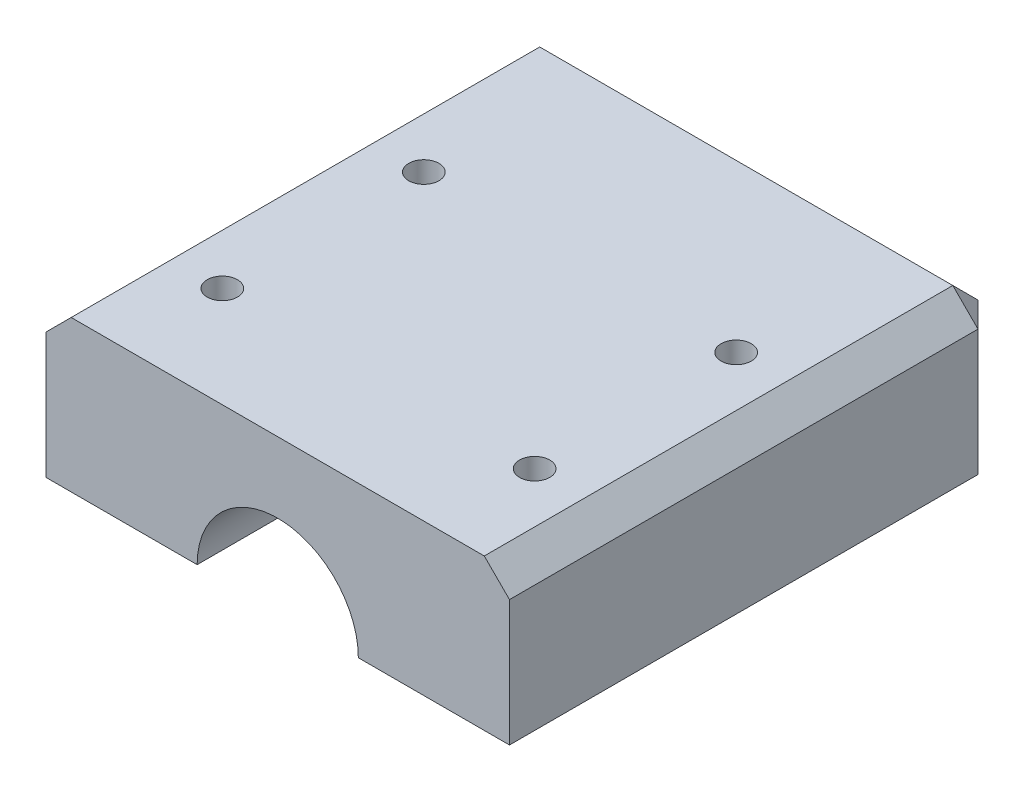
ISO-10303-21;
HEADER;
FILE_DESCRIPTION(('STEP AP214'),'2;1');
FILE_NAME('part.step','',(''),(''),'','','');
FILE_SCHEMA(('AUTOMOTIVE_DESIGN { 1 0 10303 214 1 1 1 1 }'));
ENDSEC;
DATA;
#1=APPLICATION_CONTEXT('core data for automotive mechanical design processes');
#2=APPLICATION_PROTOCOL_DEFINITION('international standard','automotive_design',2000,#1);
#3=PRODUCT_CONTEXT('',#1,'mechanical');
#4=PRODUCT('Part','Part','',(#3));
#5=PRODUCT_RELATED_PRODUCT_CATEGORY('part','',(#4));
#6=PRODUCT_DEFINITION_FORMATION('','',#4);
#7=PRODUCT_DEFINITION_CONTEXT('part definition',#1,'design');
#8=PRODUCT_DEFINITION('design','',#6,#7);
#9=PRODUCT_DEFINITION_SHAPE('','',#8);
#10=(LENGTH_UNIT() NAMED_UNIT(*) SI_UNIT(.MILLI.,.METRE.));
#11=(NAMED_UNIT(*) PLANE_ANGLE_UNIT() SI_UNIT($,.RADIAN.));
#12=(NAMED_UNIT(*) SI_UNIT($,.STERADIAN.) SOLID_ANGLE_UNIT());
#13=UNCERTAINTY_MEASURE_WITH_UNIT(LENGTH_MEASURE(1.E-05),#10,'distance_accuracy_value','');
#14=(GEOMETRIC_REPRESENTATION_CONTEXT(3) GLOBAL_UNCERTAINTY_ASSIGNED_CONTEXT((#13)) GLOBAL_UNIT_ASSIGNED_CONTEXT((#10,
#11,#12)) REPRESENTATION_CONTEXT('',''));
#15=CARTESIAN_POINT('',(0.,0.,0.));
#16=DIRECTION('',(0.,0.,1.));
#17=DIRECTION('',(1.,0.,0.));
#18=AXIS2_PLACEMENT_3D('',#15,#16,#17);
#19=CARTESIAN_POINT('',(0.,0.,-45.));
#20=DIRECTION('',(0.,0.,1.));
#21=DIRECTION('',(1.,0.,0.));
#22=AXIS2_PLACEMENT_3D('',#19,#20,#21);
#23=PLANE('',#22);
#24=DIRECTION('',(0.,-1.,0.));
#25=VECTOR('',#24,1.);
#26=CARTESIAN_POINT('',(-18.,0.,-45.));
#27=LINE('',#26,#25);
#28=CARTESIAN_POINT('',(-18.,4.,-45.));
#29=VERTEX_POINT('',#28);
#30=CARTESIAN_POINT('',(-18.,0.,-45.));
#31=VERTEX_POINT('',#30);
#32=EDGE_CURVE('E152',#29,#31,#27,.T.);
#33=ORIENTED_EDGE('',*,*,#32,.F.);
#34=DIRECTION('',(-1.,0.,0.));
#35=VECTOR('',#34,1.);
#36=CARTESIAN_POINT('',(18.,4.,-45.));
#37=LINE('',#36,#35);
#38=CARTESIAN_POINT('',(18.,4.,-45.));
#39=VERTEX_POINT('',#38);
#40=EDGE_CURVE('E181',#39,#29,#37,.T.);
#41=ORIENTED_EDGE('',*,*,#40,.F.);
#42=DIRECTION('',(0.,1.,0.));
#43=VECTOR('',#42,1.);
#44=CARTESIAN_POINT('',(18.,0.,-45.));
#45=LINE('',#44,#43);
#46=CARTESIAN_POINT('',(18.,0.,-45.));
#47=VERTEX_POINT('',#46);
#48=EDGE_CURVE('E179',#47,#39,#45,.T.);
#49=ORIENTED_EDGE('',*,*,#48,.F.);
#50=DIRECTION('',(1.,0.,0.));
#51=VECTOR('',#50,1.);
#52=CARTESIAN_POINT('',(8.,0.,-45.));
#53=LINE('',#52,#51);
#54=EDGE_CURVE('E160',#31,#47,#53,.T.);
#55=ORIENTED_EDGE('',*,*,#54,.F.);
#56=EDGE_LOOP('',(#33,#41,#49,#55));
#57=FACE_BOUND('',#56,.T.);
#58=ADVANCED_FACE('F42',(#57),#23,.F.);
#59=CARTESIAN_POINT('',(0.,0.,-45.));
#60=DIRECTION('',(0.,0.,1.));
#61=DIRECTION('',(1.,0.,0.));
#62=AXIS2_PLACEMENT_3D('',#59,#60,#61);
#63=CYLINDRICAL_SURFACE('',#62,8.);
#64=CARTESIAN_POINT('',(0.,0.,-40.));
#65=DIRECTION('',(0.,0.,1.));
#66=DIRECTION('',(1.,0.,0.));
#67=AXIS2_PLACEMENT_3D('',#64,#65,#66);
#68=CIRCLE('',#67,8.);
#69=CARTESIAN_POINT('',(8.,0.,-40.));
#70=VERTEX_POINT('',#69);
#71=CARTESIAN_POINT('',(-8.,0.,-40.));
#72=VERTEX_POINT('',#71);
#73=EDGE_CURVE('E193',#70,#72,#68,.T.);
#74=ORIENTED_EDGE('',*,*,#73,.F.);
#75=DIRECTION('',(0.,0.,1.));
#76=VECTOR('',#75,1.);
#77=CARTESIAN_POINT('',(8.,0.,-45.));
#78=LINE('',#77,#76);
#79=CARTESIAN_POINT('',(8.,0.,0.));
#80=VERTEX_POINT('',#79);
#81=EDGE_CURVE('E198',#70,#80,#78,.T.);
#82=ORIENTED_EDGE('',*,*,#81,.T.);
#83=CARTESIAN_POINT('',(0.,0.,0.));
#84=DIRECTION('',(0.,0.,-1.));
#85=DIRECTION('',(1.,0.,0.));
#86=AXIS2_PLACEMENT_3D('',#83,#84,#85);
#87=CIRCLE('',#86,8.);
#88=CARTESIAN_POINT('',(-8.,0.,0.));
#89=VERTEX_POINT('',#88);
#90=EDGE_CURVE('E196',#89,#80,#87,.T.);
#91=ORIENTED_EDGE('',*,*,#90,.F.);
#92=DIRECTION('',(0.,0.,1.));
#93=VECTOR('',#92,1.);
#94=CARTESIAN_POINT('',(-8.,0.,-45.));
#95=LINE('',#94,#93);
#96=EDGE_CURVE('E216',#72,#89,#95,.T.);
#97=ORIENTED_EDGE('',*,*,#96,.F.);
#98=EDGE_LOOP('',(#74,#82,#91,#97));
#99=FACE_BOUND('',#98,.T.);
#100=ADVANCED_FACE('F336',(#99),#63,.F.);
#101=CARTESIAN_POINT('',(-8.,0.,-45.));
#102=DIRECTION('',(0.,-1.,0.));
#103=DIRECTION('',(1.,0.,0.));
#104=AXIS2_PLACEMENT_3D('',#101,#102,#103);
#105=PLANE('',#104);
#106=CARTESIAN_POINT('',(-15.5,0.,-10.));
#107=DIRECTION('',(0.,-1.,0.));
#108=DIRECTION('',(-1.,0.,0.));
#109=AXIS2_PLACEMENT_3D('',#106,#107,#108);
#110=CIRCLE('',#109,1.5);
#111=CARTESIAN_POINT('',(-17.,0.,-10.));
#112=VERTEX_POINT('',#111);
#113=EDGE_CURVE('E551',#112,#112,#110,.T.);
#114=ORIENTED_EDGE('',*,*,#113,.F.);
#115=EDGE_LOOP('',(#114));
#116=FACE_BOUND('',#115,.T.);
#117=CARTESIAN_POINT('',(-15.5,0.,-30.));
#118=DIRECTION('',(0.,-1.,0.));
#119=DIRECTION('',(-1.,0.,0.));
#120=AXIS2_PLACEMENT_3D('',#117,#118,#119);
#121=CIRCLE('',#120,1.5);
#122=CARTESIAN_POINT('',(-17.,0.,-30.));
#123=VERTEX_POINT('',#122);
#124=EDGE_CURVE('E548',#123,#123,#121,.T.);
#125=ORIENTED_EDGE('',*,*,#124,.F.);
#126=EDGE_LOOP('',(#125));
#127=FACE_BOUND('',#126,.T.);
#128=CARTESIAN_POINT('',(15.5,0.,-30.));
#129=DIRECTION('',(0.,-1.,0.));
#130=DIRECTION('',(1.,0.,0.));
#131=AXIS2_PLACEMENT_3D('',#128,#129,#130);
#132=CIRCLE('',#131,1.5);
#133=CARTESIAN_POINT('',(17.,0.,-30.));
#134=VERTEX_POINT('',#133);
#135=EDGE_CURVE('E550',#134,#134,#132,.T.);
#136=ORIENTED_EDGE('',*,*,#135,.F.);
#137=EDGE_LOOP('',(#136));
#138=FACE_BOUND('',#137,.T.);
#139=CARTESIAN_POINT('',(15.5,0.,-10.));
#140=DIRECTION('',(0.,-1.,0.));
#141=DIRECTION('',(1.,0.,0.));
#142=AXIS2_PLACEMENT_3D('',#139,#140,#141);
#143=CIRCLE('',#142,1.5);
#144=CARTESIAN_POINT('',(17.,0.,-10.));
#145=VERTEX_POINT('',#144);
#146=EDGE_CURVE('E268',#145,#145,#143,.T.);
#147=ORIENTED_EDGE('',*,*,#146,.F.);
#148=EDGE_LOOP('',(#147));
#149=FACE_BOUND('',#148,.T.);
#150=DIRECTION('',(0.,0.,1.));
#151=VECTOR('',#150,1.);
#152=CARTESIAN_POINT('',(-23.,0.,-45.));
#153=LINE('',#152,#151);
#154=CARTESIAN_POINT('',(-23.,0.,-46.5));
#155=VERTEX_POINT('',#154);
#156=CARTESIAN_POINT('',(-23.,0.,0.));
#157=VERTEX_POINT('',#156);
#158=EDGE_CURVE('E219',#155,#157,#153,.T.);
#159=ORIENTED_EDGE('',*,*,#158,.F.);
#160=DIRECTION('',(-0.707106781186546,0.,0.70710678118655));
#161=VECTOR('',#160,1.);
#162=CARTESIAN_POINT('',(-16.25,0.,-53.25));
#163=LINE('',#162,#161);
#164=CARTESIAN_POINT('',(-20.5,0.,-49.));
#165=VERTEX_POINT('',#164);
#166=EDGE_CURVE('E244',#155,#165,#163,.F.);
#167=ORIENTED_EDGE('',*,*,#166,.T.);
#168=DIRECTION('',(-1.,0.,0.));
#169=VECTOR('',#168,1.);
#170=CARTESIAN_POINT('',(-23.,0.,-49.));
#171=LINE('',#170,#169);
#172=CARTESIAN_POINT('',(-18.,0.,-49.));
#173=VERTEX_POINT('',#172);
#174=EDGE_CURVE('E176',#173,#165,#171,.T.);
#175=ORIENTED_EDGE('',*,*,#174,.F.);
#176=DIRECTION('',(0.,0.,1.));
#177=VECTOR('',#176,1.);
#178=CARTESIAN_POINT('',(-18.,0.,-49.));
#179=LINE('',#178,#177);
#180=EDGE_CURVE('E178',#173,#31,#179,.T.);
#181=ORIENTED_EDGE('',*,*,#180,.T.);
#182=ORIENTED_EDGE('',*,*,#54,.T.);
#183=DIRECTION('',(0.,0.,1.));
#184=VECTOR('',#183,1.);
#185=CARTESIAN_POINT('',(18.,0.,-49.));
#186=LINE('',#185,#184);
#187=CARTESIAN_POINT('',(18.,0.,-49.));
#188=VERTEX_POINT('',#187);
#189=EDGE_CURVE('E156',#188,#47,#186,.T.);
#190=ORIENTED_EDGE('',*,*,#189,.F.);
#191=DIRECTION('',(-1.,0.,0.));
#192=VECTOR('',#191,1.);
#193=CARTESIAN_POINT('',(23.,0.,-49.));
#194=LINE('',#193,#192);
#195=CARTESIAN_POINT('',(20.5,0.,-49.));
#196=VERTEX_POINT('',#195);
#197=EDGE_CURVE('E143',#196,#188,#194,.T.);
#198=ORIENTED_EDGE('',*,*,#197,.F.);
#199=DIRECTION('',(-0.70710678118655,0.,-0.707106781186546));
#200=VECTOR('',#199,1.);
#201=CARTESIAN_POINT('',(8.24999999999992,0.,-61.25));
#202=LINE('',#201,#200);
#203=CARTESIAN_POINT('',(23.,0.,-46.5));
#204=VERTEX_POINT('',#203);
#205=EDGE_CURVE('E66',#196,#204,#202,.F.);
#206=ORIENTED_EDGE('',*,*,#205,.T.);
#207=DIRECTION('',(0.,0.,1.));
#208=VECTOR('',#207,1.);
#209=CARTESIAN_POINT('',(23.,0.,-45.));
#210=LINE('',#209,#208);
#211=CARTESIAN_POINT('',(23.,0.,0.));
#212=VERTEX_POINT('',#211);
#213=EDGE_CURVE('E221',#204,#212,#210,.T.);
#214=ORIENTED_EDGE('',*,*,#213,.T.);
#215=DIRECTION('',(1.,0.,0.));
#216=VECTOR('',#215,1.);
#217=CARTESIAN_POINT('',(8.,0.,0.));
#218=LINE('',#217,#216);
#219=EDGE_CURVE('E202',#80,#212,#218,.T.);
#220=ORIENTED_EDGE('',*,*,#219,.F.);
#221=ORIENTED_EDGE('',*,*,#81,.F.);
#222=DIRECTION('',(-1.,0.,0.));
#223=VECTOR('',#222,1.);
#224=CARTESIAN_POINT('',(23.,0.,-40.));
#225=LINE('',#224,#223);
#226=EDGE_CURVE('E163',#70,#72,#225,.T.);
#227=ORIENTED_EDGE('',*,*,#226,.T.);
#228=ORIENTED_EDGE('',*,*,#96,.T.);
#229=DIRECTION('',(1.,0.,0.));
#230=VECTOR('',#229,1.);
#231=CARTESIAN_POINT('',(-8.,0.,0.));
#232=LINE('',#231,#230);
#233=EDGE_CURVE('E199',#157,#89,#232,.T.);
#234=ORIENTED_EDGE('',*,*,#233,.F.);
#235=EDGE_LOOP('',(#159,#167,#175,#181,#182,#190,#198,#206,#214,#220,#221,#227,#228,#234));
#236=FACE_BOUND('',#235,.T.);
#237=ADVANCED_FACE('F158',(#116,#127,#138,#149,#236),#105,.T.);
#238=CARTESIAN_POINT('',(-23.,0.,-45.));
#239=DIRECTION('',(-1.,0.,0.));
#240=DIRECTION('',(0.,0.,1.));
#241=AXIS2_PLACEMENT_3D('',#238,#239,#240);
#242=PLANE('',#241);
#243=DIRECTION('',(0.,-1.,0.));
#244=VECTOR('',#243,1.);
#245=CARTESIAN_POINT('',(-23.,0.,0.));
#246=LINE('',#245,#244);
#247=CARTESIAN_POINT('',(-23.,12.5,0.));
#248=VERTEX_POINT('',#247);
#249=EDGE_CURVE('E211',#248,#157,#246,.T.);
#250=ORIENTED_EDGE('',*,*,#249,.F.);
#251=DIRECTION('',(0.,0.,-1.));
#252=VECTOR('',#251,1.);
#253=CARTESIAN_POINT('',(-23.,12.5,-45.));
#254=LINE('',#253,#252);
#255=CARTESIAN_POINT('',(-23.,12.5,-46.5));
#256=VERTEX_POINT('',#255);
#257=EDGE_CURVE('E236',#248,#256,#254,.T.);
#258=ORIENTED_EDGE('',*,*,#257,.T.);
#259=DIRECTION('',(0.,-1.,0.));
#260=VECTOR('',#259,1.);
#261=CARTESIAN_POINT('',(-23.,0.,-46.5));
#262=LINE('',#261,#260);
#263=EDGE_CURVE('E234',#256,#155,#262,.T.);
#264=ORIENTED_EDGE('',*,*,#263,.T.);
#265=ORIENTED_EDGE('',*,*,#158,.T.);
#266=EDGE_LOOP('',(#250,#258,#264,#265));
#267=FACE_BOUND('',#266,.T.);
#268=ADVANCED_FACE('F284',(#267),#242,.T.);
#269=CARTESIAN_POINT('',(-23.,15.,-45.));
#270=DIRECTION('',(0.,1.,0.));
#271=DIRECTION('',(-1.,0.,0.));
#272=AXIS2_PLACEMENT_3D('',#269,#270,#271);
#273=PLANE('',#272);
#274=CARTESIAN_POINT('',(-15.5,15.,-10.));
#275=DIRECTION('',(0.,1.,0.));
#276=DIRECTION('',(-1.,0.,0.));
#277=AXIS2_PLACEMENT_3D('',#274,#275,#276);
#278=CIRCLE('',#277,1.5);
#279=CARTESIAN_POINT('',(-17.,15.,-10.));
#280=VERTEX_POINT('',#279);
#281=EDGE_CURVE('E47',#280,#280,#278,.T.);
#282=ORIENTED_EDGE('',*,*,#281,.F.);
#283=EDGE_LOOP('',(#282));
#284=FACE_BOUND('',#283,.T.);
#285=CARTESIAN_POINT('',(-15.5,15.,-30.));
#286=DIRECTION('',(0.,1.,0.));
#287=DIRECTION('',(-1.,0.,0.));
#288=AXIS2_PLACEMENT_3D('',#285,#286,#287);
#289=CIRCLE('',#288,1.5);
#290=CARTESIAN_POINT('',(-17.,15.,-30.));
#291=VERTEX_POINT('',#290);
#292=EDGE_CURVE('E270',#291,#291,#289,.T.);
#293=ORIENTED_EDGE('',*,*,#292,.F.);
#294=EDGE_LOOP('',(#293));
#295=FACE_BOUND('',#294,.T.);
#296=CARTESIAN_POINT('',(15.5,15.,-30.));
#297=DIRECTION('',(0.,1.,0.));
#298=DIRECTION('',(-1.,0.,0.));
#299=AXIS2_PLACEMENT_3D('',#296,#297,#298);
#300=CIRCLE('',#299,1.5);
#301=CARTESIAN_POINT('',(14.,15.,-30.));
#302=VERTEX_POINT('',#301);
#303=EDGE_CURVE('E267',#302,#302,#300,.T.);
#304=ORIENTED_EDGE('',*,*,#303,.F.);
#305=EDGE_LOOP('',(#304));
#306=FACE_BOUND('',#305,.T.);
#307=CARTESIAN_POINT('',(15.5,15.,-10.));
#308=DIRECTION('',(0.,1.,0.));
#309=DIRECTION('',(-1.,0.,0.));
#310=AXIS2_PLACEMENT_3D('',#307,#308,#309);
#311=CIRCLE('',#310,1.5);
#312=CARTESIAN_POINT('',(14.,15.,-10.));
#313=VERTEX_POINT('',#312);
#314=EDGE_CURVE('E264',#313,#313,#311,.T.);
#315=ORIENTED_EDGE('',*,*,#314,.F.);
#316=EDGE_LOOP('',(#315));
#317=FACE_BOUND('',#316,.T.);
#318=DIRECTION('',(-1.,0.,0.));
#319=VECTOR('',#318,1.);
#320=CARTESIAN_POINT('',(-23.,15.,-46.5));
#321=LINE('',#320,#319);
#322=CARTESIAN_POINT('',(20.5,15.,-46.5));
#323=VERTEX_POINT('',#322);
#324=CARTESIAN_POINT('',(-20.5,15.,-46.5));
#325=VERTEX_POINT('',#324);
#326=EDGE_CURVE('E225',#323,#325,#321,.T.);
#327=ORIENTED_EDGE('',*,*,#326,.T.);
#328=DIRECTION('',(0.,0.,1.));
#329=VECTOR('',#328,1.);
#330=CARTESIAN_POINT('',(-20.5,15.,-45.));
#331=LINE('',#330,#329);
#332=CARTESIAN_POINT('',(-20.5,15.,0.));
#333=VERTEX_POINT('',#332);
#334=EDGE_CURVE('E227',#325,#333,#331,.T.);
#335=ORIENTED_EDGE('',*,*,#334,.T.);
#336=DIRECTION('',(-1.,0.,0.));
#337=VECTOR('',#336,1.);
#338=CARTESIAN_POINT('',(-23.,15.,0.));
#339=LINE('',#338,#337);
#340=CARTESIAN_POINT('',(20.5,15.,0.));
#341=VERTEX_POINT('',#340);
#342=EDGE_CURVE('E208',#341,#333,#339,.T.);
#343=ORIENTED_EDGE('',*,*,#342,.F.);
#344=DIRECTION('',(0.,0.,-1.));
#345=VECTOR('',#344,1.);
#346=CARTESIAN_POINT('',(20.5,15.,-45.));
#347=LINE('',#346,#345);
#348=EDGE_CURVE('E218',#341,#323,#347,.T.);
#349=ORIENTED_EDGE('',*,*,#348,.T.);
#350=EDGE_LOOP('',(#327,#335,#343,#349));
#351=FACE_BOUND('',#350,.T.);
#352=ADVANCED_FACE('F280',(#284,#295,#306,#317,#351),#273,.T.);
#353=CARTESIAN_POINT('',(23.,0.,-45.));
#354=DIRECTION('',(1.,0.,0.));
#355=DIRECTION('',(0.,1.,0.));
#356=AXIS2_PLACEMENT_3D('',#353,#354,#355);
#357=PLANE('',#356);
#358=ORIENTED_EDGE('',*,*,#213,.F.);
#359=DIRECTION('',(0.,1.,0.));
#360=VECTOR('',#359,1.);
#361=CARTESIAN_POINT('',(23.,0.,-46.5));
#362=LINE('',#361,#360);
#363=CARTESIAN_POINT('',(23.,12.5,-46.5));
#364=VERTEX_POINT('',#363);
#365=EDGE_CURVE('E11',#204,#364,#362,.T.);
#366=ORIENTED_EDGE('',*,*,#365,.T.);
#367=DIRECTION('',(0.,0.,1.));
#368=VECTOR('',#367,1.);
#369=CARTESIAN_POINT('',(23.,12.5,-45.));
#370=LINE('',#369,#368);
#371=CARTESIAN_POINT('',(23.,12.5,0.));
#372=VERTEX_POINT('',#371);
#373=EDGE_CURVE('E52',#364,#372,#370,.T.);
#374=ORIENTED_EDGE('',*,*,#373,.T.);
#375=DIRECTION('',(0.,1.,0.));
#376=VECTOR('',#375,1.);
#377=CARTESIAN_POINT('',(23.,0.,0.));
#378=LINE('',#377,#376);
#379=EDGE_CURVE('E205',#212,#372,#378,.T.);
#380=ORIENTED_EDGE('',*,*,#379,.F.);
#381=EDGE_LOOP('',(#358,#366,#374,#380));
#382=FACE_BOUND('',#381,.T.);
#383=ADVANCED_FACE('F283',(#382),#357,.T.);
#384=CARTESIAN_POINT('',(0.,0.,0.));
#385=DIRECTION('',(0.,0.,1.));
#386=DIRECTION('',(1.,0.,0.));
#387=AXIS2_PLACEMENT_3D('',#384,#385,#386);
#388=PLANE('',#387);
#389=ORIENTED_EDGE('',*,*,#342,.T.);
#390=DIRECTION('',(0.707106781186549,0.707106781186546,0.));
#391=VECTOR('',#390,1.);
#392=CARTESIAN_POINT('',(-17.7499999999999,17.75,0.));
#393=LINE('',#392,#391);
#394=EDGE_CURVE('E232',#333,#248,#393,.F.);
#395=ORIENTED_EDGE('',*,*,#394,.T.);
#396=ORIENTED_EDGE('',*,*,#249,.T.);
#397=ORIENTED_EDGE('',*,*,#233,.T.);
#398=ORIENTED_EDGE('',*,*,#90,.T.);
#399=ORIENTED_EDGE('',*,*,#219,.T.);
#400=ORIENTED_EDGE('',*,*,#379,.T.);
#401=DIRECTION('',(0.707106781186551,-0.707106781186544,0.));
#402=VECTOR('',#401,1.);
#403=CARTESIAN_POINT('',(17.7499999999999,17.7500000000001,0.));
#404=LINE('',#403,#402);
#405=EDGE_CURVE('E230',#372,#341,#404,.F.);
#406=ORIENTED_EDGE('',*,*,#405,.T.);
#407=EDGE_LOOP('',(#389,#395,#396,#397,#398,#399,#400,#406));
#408=FACE_BOUND('',#407,.T.);
#409=ADVANCED_FACE('F309',(#408),#388,.T.);
#410=CARTESIAN_POINT('',(23.,14.,-40.));
#411=DIRECTION('',(0.,0.,1.));
#412=DIRECTION('',(1.,0.,0.));
#413=AXIS2_PLACEMENT_3D('',#410,#411,#412);
#414=PLANE('',#413);
#415=ORIENTED_EDGE('',*,*,#226,.F.);
#416=ORIENTED_EDGE('',*,*,#73,.T.);
#417=EDGE_LOOP('',(#415,#416));
#418=FACE_BOUND('',#417,.T.);
#419=ADVANCED_FACE('F333',(#418),#414,.T.);
#420=CARTESIAN_POINT('',(18.,0.,-49.));
#421=DIRECTION('',(1.,0.,0.));
#422=DIRECTION('',(0.,0.,-1.));
#423=AXIS2_PLACEMENT_3D('',#420,#421,#422);
#424=PLANE('',#423);
#425=ORIENTED_EDGE('',*,*,#48,.T.);
#426=DIRECTION('',(0.,0.,1.));
#427=VECTOR('',#426,1.);
#428=CARTESIAN_POINT('',(18.,4.,-49.));
#429=LINE('',#428,#427);
#430=CARTESIAN_POINT('',(18.,4.,-49.));
#431=VERTEX_POINT('',#430);
#432=EDGE_CURVE('E164',#431,#39,#429,.T.);
#433=ORIENTED_EDGE('',*,*,#432,.F.);
#434=DIRECTION('',(0.,1.,0.));
#435=VECTOR('',#434,1.);
#436=CARTESIAN_POINT('',(18.,0.,-49.));
#437=LINE('',#436,#435);
#438=EDGE_CURVE('E148',#188,#431,#437,.T.);
#439=ORIENTED_EDGE('',*,*,#438,.F.);
#440=ORIENTED_EDGE('',*,*,#189,.T.);
#441=EDGE_LOOP('',(#425,#433,#439,#440));
#442=FACE_BOUND('',#441,.T.);
#443=ADVANCED_FACE('F166',(#442),#424,.F.);
#444=CARTESIAN_POINT('',(18.,4.,-49.));
#445=DIRECTION('',(0.,1.,0.));
#446=DIRECTION('',(0.,0.,1.));
#447=AXIS2_PLACEMENT_3D('',#444,#445,#446);
#448=PLANE('',#447);
#449=ORIENTED_EDGE('',*,*,#40,.T.);
#450=DIRECTION('',(0.,0.,1.));
#451=VECTOR('',#450,1.);
#452=CARTESIAN_POINT('',(-18.,4.,-49.));
#453=LINE('',#452,#451);
#454=CARTESIAN_POINT('',(-18.,4.,-49.));
#455=VERTEX_POINT('',#454);
#456=EDGE_CURVE('E188',#455,#29,#453,.T.);
#457=ORIENTED_EDGE('',*,*,#456,.F.);
#458=DIRECTION('',(-1.,0.,0.));
#459=VECTOR('',#458,1.);
#460=CARTESIAN_POINT('',(18.,4.,-49.));
#461=LINE('',#460,#459);
#462=EDGE_CURVE('E169',#431,#455,#461,.T.);
#463=ORIENTED_EDGE('',*,*,#462,.F.);
#464=ORIENTED_EDGE('',*,*,#432,.T.);
#465=EDGE_LOOP('',(#449,#457,#463,#464));
#466=FACE_BOUND('',#465,.T.);
#467=ADVANCED_FACE('F325',(#466),#448,.F.);
#468=CARTESIAN_POINT('',(-18.,0.,-49.));
#469=DIRECTION('',(-1.,0.,0.));
#470=DIRECTION('',(0.,0.,1.));
#471=AXIS2_PLACEMENT_3D('',#468,#469,#470);
#472=PLANE('',#471);
#473=ORIENTED_EDGE('',*,*,#32,.T.);
#474=ORIENTED_EDGE('',*,*,#180,.F.);
#475=DIRECTION('',(0.,-1.,0.));
#476=VECTOR('',#475,1.);
#477=CARTESIAN_POINT('',(-18.,0.,-49.));
#478=LINE('',#477,#476);
#479=EDGE_CURVE('E171',#455,#173,#478,.T.);
#480=ORIENTED_EDGE('',*,*,#479,.F.);
#481=ORIENTED_EDGE('',*,*,#456,.T.);
#482=EDGE_LOOP('',(#473,#474,#480,#481));
#483=FACE_BOUND('',#482,.T.);
#484=ADVANCED_FACE('F321',(#483),#472,.F.);
#485=CARTESIAN_POINT('',(0.,0.,-49.));
#486=DIRECTION('',(0.,0.,-1.));
#487=DIRECTION('',(-1.,0.,0.));
#488=AXIS2_PLACEMENT_3D('',#485,#486,#487);
#489=PLANE('',#488);
#490=ORIENTED_EDGE('',*,*,#174,.T.);
#491=DIRECTION('',(0.,1.,0.));
#492=VECTOR('',#491,1.);
#493=CARTESIAN_POINT('',(-20.5,0.,-49.));
#494=LINE('',#493,#492);
#495=CARTESIAN_POINT('',(-20.5,12.5,-49.));
#496=VERTEX_POINT('',#495);
#497=EDGE_CURVE('E241',#165,#496,#494,.T.);
#498=ORIENTED_EDGE('',*,*,#497,.T.);
#499=DIRECTION('',(1.,0.,0.));
#500=VECTOR('',#499,1.);
#501=CARTESIAN_POINT('',(0.,12.5,-49.));
#502=LINE('',#501,#500);
#503=CARTESIAN_POINT('',(20.5,12.5,-49.));
#504=VERTEX_POINT('',#503);
#505=EDGE_CURVE('E238',#496,#504,#502,.T.);
#506=ORIENTED_EDGE('',*,*,#505,.T.);
#507=DIRECTION('',(0.,-1.,0.));
#508=VECTOR('',#507,1.);
#509=CARTESIAN_POINT('',(20.5,0.,-49.));
#510=LINE('',#509,#508);
#511=EDGE_CURVE('E151',#504,#196,#510,.T.);
#512=ORIENTED_EDGE('',*,*,#511,.T.);
#513=ORIENTED_EDGE('',*,*,#197,.T.);
#514=ORIENTED_EDGE('',*,*,#438,.T.);
#515=ORIENTED_EDGE('',*,*,#462,.T.);
#516=ORIENTED_EDGE('',*,*,#479,.T.);
#517=EDGE_LOOP('',(#490,#498,#506,#512,#513,#514,#515,#516));
#518=FACE_BOUND('',#517,.T.);
#519=ADVANCED_FACE('F146',(#518),#489,.T.);
#520=CARTESIAN_POINT('',(20.5,0.,-49.));
#521=DIRECTION('',(-0.707106781186545,0.,0.707106781186549));
#522=DIRECTION('',(0.,-1.,0.));
#523=AXIS2_PLACEMENT_3D('',#520,#521,#522);
#524=PLANE('',#523);
#525=ORIENTED_EDGE('',*,*,#205,.F.);
#526=ORIENTED_EDGE('',*,*,#511,.F.);
#527=DIRECTION('',(0.707106781186549,0.,0.707106781186546));
#528=VECTOR('',#527,1.);
#529=CARTESIAN_POINT('',(23.,12.5,-46.5));
#530=LINE('',#529,#528);
#531=EDGE_CURVE('E182',#364,#504,#530,.F.);
#532=ORIENTED_EDGE('',*,*,#531,.F.);
#533=ORIENTED_EDGE('',*,*,#365,.F.);
#534=EDGE_LOOP('',(#525,#526,#532,#533));
#535=FACE_BOUND('',#534,.T.);
#536=ADVANCED_FACE('F45',(#535),#524,.F.);
#537=CARTESIAN_POINT('',(23.,12.5,-45.));
#538=DIRECTION('',(-0.707106781186544,-0.707106781186551,0.));
#539=DIRECTION('',(0.,0.,1.));
#540=AXIS2_PLACEMENT_3D('',#537,#538,#539);
#541=PLANE('',#540);
#542=ORIENTED_EDGE('',*,*,#405,.F.);
#543=ORIENTED_EDGE('',*,*,#373,.F.);
#544=DIRECTION('',(-0.707106781186551,0.707106781186544,0.));
#545=VECTOR('',#544,1.);
#546=CARTESIAN_POINT('',(23.,12.5,-46.5));
#547=LINE('',#546,#545);
#548=EDGE_CURVE('E259',#323,#364,#547,.F.);
#549=ORIENTED_EDGE('',*,*,#548,.F.);
#550=ORIENTED_EDGE('',*,*,#348,.F.);
#551=EDGE_LOOP('',(#542,#543,#549,#550));
#552=FACE_BOUND('',#551,.T.);
#553=ADVANCED_FACE('F381',(#552),#541,.F.);
#554=CARTESIAN_POINT('',(23.,12.5,-46.5));
#555=DIRECTION('',(0.577350269189622,0.57735026918963,-0.577350269189625));
#556=DIRECTION('',(0.,0.707106781186544,0.707106781186551));
#557=AXIS2_PLACEMENT_3D('',#554,#555,#556);
#558=PLANE('',#557);
#559=ORIENTED_EDGE('',*,*,#548,.T.);
#560=ORIENTED_EDGE('',*,*,#531,.T.);
#561=DIRECTION('',(0.,-0.707106781186545,-0.70710678118655));
#562=VECTOR('',#561,1.);
#563=CARTESIAN_POINT('',(20.5,13.75,-47.75));
#564=LINE('',#563,#562);
#565=EDGE_CURVE('E256',#323,#504,#564,.T.);
#566=ORIENTED_EDGE('',*,*,#565,.F.);
#567=EDGE_LOOP('',(#559,#560,#566));
#568=FACE_BOUND('',#567,.T.);
#569=ADVANCED_FACE('F376',(#568),#558,.T.);
#570=CARTESIAN_POINT('',(-20.5,0.,-49.));
#571=DIRECTION('',(0.707106781186549,0.,0.707106781186545));
#572=DIRECTION('',(0.,1.,0.));
#573=AXIS2_PLACEMENT_3D('',#570,#571,#572);
#574=PLANE('',#573);
#575=ORIENTED_EDGE('',*,*,#166,.F.);
#576=ORIENTED_EDGE('',*,*,#263,.F.);
#577=DIRECTION('',(0.707106781186546,0.,-0.70710678118655));
#578=VECTOR('',#577,1.);
#579=CARTESIAN_POINT('',(-23.,12.5,-46.5));
#580=LINE('',#579,#578);
#581=EDGE_CURVE('E253',#496,#256,#580,.F.);
#582=ORIENTED_EDGE('',*,*,#581,.F.);
#583=ORIENTED_EDGE('',*,*,#497,.F.);
#584=EDGE_LOOP('',(#575,#576,#582,#583));
#585=FACE_BOUND('',#584,.T.);
#586=ADVANCED_FACE('F317',(#585),#574,.F.);
#587=CARTESIAN_POINT('',(0.,12.5,-49.));
#588=DIRECTION('',(0.,-0.70710678118655,0.707106781186545));
#589=DIRECTION('',(1.,0.,0.));
#590=AXIS2_PLACEMENT_3D('',#587,#588,#589);
#591=PLANE('',#590);
#592=ORIENTED_EDGE('',*,*,#565,.T.);
#593=ORIENTED_EDGE('',*,*,#505,.F.);
#594=DIRECTION('',(0.,0.707106781186545,0.70710678118655));
#595=VECTOR('',#594,1.);
#596=CARTESIAN_POINT('',(-20.5,13.75,-47.75));
#597=LINE('',#596,#595);
#598=EDGE_CURVE('E250',#325,#496,#597,.F.);
#599=ORIENTED_EDGE('',*,*,#598,.F.);
#600=ORIENTED_EDGE('',*,*,#326,.F.);
#601=EDGE_LOOP('',(#592,#593,#599,#600));
#602=FACE_BOUND('',#601,.T.);
#603=ADVANCED_FACE('F300',(#602),#591,.F.);
#604=CARTESIAN_POINT('',(-23.,12.5,-46.5));
#605=DIRECTION('',(-0.577350269189626,0.577350269189629,-0.577350269189622));
#606=DIRECTION('',(-0.707106781186549,-0.707106781186546,0.));
#607=AXIS2_PLACEMENT_3D('',#604,#605,#606);
#608=PLANE('',#607);
#609=ORIENTED_EDGE('',*,*,#598,.T.);
#610=ORIENTED_EDGE('',*,*,#581,.T.);
#611=DIRECTION('',(-0.707106781186549,-0.707106781186546,0.));
#612=VECTOR('',#611,1.);
#613=CARTESIAN_POINT('',(-23.,12.5,-46.5));
#614=LINE('',#613,#612);
#615=EDGE_CURVE('E247',#325,#256,#614,.T.);
#616=ORIENTED_EDGE('',*,*,#615,.F.);
#617=EDGE_LOOP('',(#609,#610,#616));
#618=FACE_BOUND('',#617,.T.);
#619=ADVANCED_FACE('F303',(#618),#608,.T.);
#620=CARTESIAN_POINT('',(-20.5,15.,-45.));
#621=DIRECTION('',(0.707106781186546,-0.707106781186549,0.));
#622=DIRECTION('',(0.,0.,1.));
#623=AXIS2_PLACEMENT_3D('',#620,#621,#622);
#624=PLANE('',#623);
#625=ORIENTED_EDGE('',*,*,#615,.T.);
#626=ORIENTED_EDGE('',*,*,#257,.F.);
#627=ORIENTED_EDGE('',*,*,#394,.F.);
#628=ORIENTED_EDGE('',*,*,#334,.F.);
#629=EDGE_LOOP('',(#625,#626,#627,#628));
#630=FACE_BOUND('',#629,.T.);
#631=ADVANCED_FACE('F306',(#630),#624,.F.);
#632=CARTESIAN_POINT('',(15.5,35.,-10.));
#633=DIRECTION('',(0.,-1.,0.));
#634=DIRECTION('',(1.,0.,0.));
#635=AXIS2_PLACEMENT_3D('',#632,#633,#634);
#636=CYLINDRICAL_SURFACE('',#635,1.5);
#637=ORIENTED_EDGE('',*,*,#314,.T.);
#638=EDGE_LOOP('',(#637));
#639=FACE_BOUND('',#638,.T.);
#640=ORIENTED_EDGE('',*,*,#146,.T.);
#641=EDGE_LOOP('',(#640));
#642=FACE_BOUND('',#641,.T.);
#643=ADVANCED_FACE('F360',(#639,#642),#636,.F.);
#644=CARTESIAN_POINT('',(15.5,35.,-30.));
#645=DIRECTION('',(0.,-1.,0.));
#646=DIRECTION('',(1.,0.,0.));
#647=AXIS2_PLACEMENT_3D('',#644,#645,#646);
#648=CYLINDRICAL_SURFACE('',#647,1.5);
#649=ORIENTED_EDGE('',*,*,#303,.T.);
#650=EDGE_LOOP('',(#649));
#651=FACE_BOUND('',#650,.T.);
#652=ORIENTED_EDGE('',*,*,#135,.T.);
#653=EDGE_LOOP('',(#652));
#654=FACE_BOUND('',#653,.T.);
#655=ADVANCED_FACE('F514',(#651,#654),#648,.F.);
#656=CARTESIAN_POINT('',(-15.5,35.,-30.));
#657=DIRECTION('',(0.,-1.,0.));
#658=DIRECTION('',(1.,0.,0.));
#659=AXIS2_PLACEMENT_3D('',#656,#657,#658);
#660=CYLINDRICAL_SURFACE('',#659,1.5);
#661=ORIENTED_EDGE('',*,*,#292,.T.);
#662=EDGE_LOOP('',(#661));
#663=FACE_BOUND('',#662,.T.);
#664=ORIENTED_EDGE('',*,*,#124,.T.);
#665=EDGE_LOOP('',(#664));
#666=FACE_BOUND('',#665,.T.);
#667=ADVANCED_FACE('F524',(#663,#666),#660,.F.);
#668=CARTESIAN_POINT('',(-15.5,35.,-10.));
#669=DIRECTION('',(0.,-1.,0.));
#670=DIRECTION('',(1.,0.,0.));
#671=AXIS2_PLACEMENT_3D('',#668,#669,#670);
#672=CYLINDRICAL_SURFACE('',#671,1.5);
#673=ORIENTED_EDGE('',*,*,#281,.T.);
#674=EDGE_LOOP('',(#673));
#675=FACE_BOUND('',#674,.T.);
#676=ORIENTED_EDGE('',*,*,#113,.T.);
#677=EDGE_LOOP('',(#676));
#678=FACE_BOUND('',#677,.T.);
#679=ADVANCED_FACE('F277',(#675,#678),#672,.F.);
#680=CLOSED_SHELL('',(#58,#100,#237,#268,#352,#383,#409,#419,#443,#467,#484,#519,#536,#553,#569,
#586,#603,#619,#631,#643,#655,#667,#679));
#681=MANIFOLD_SOLID_BREP('B2',#680);
#682=ADVANCED_BREP_SHAPE_REPRESENTATION('',(#18,#681),#14);
#683=SHAPE_DEFINITION_REPRESENTATION(#9,#682);
ENDSEC;
END-ISO-10303-21;
